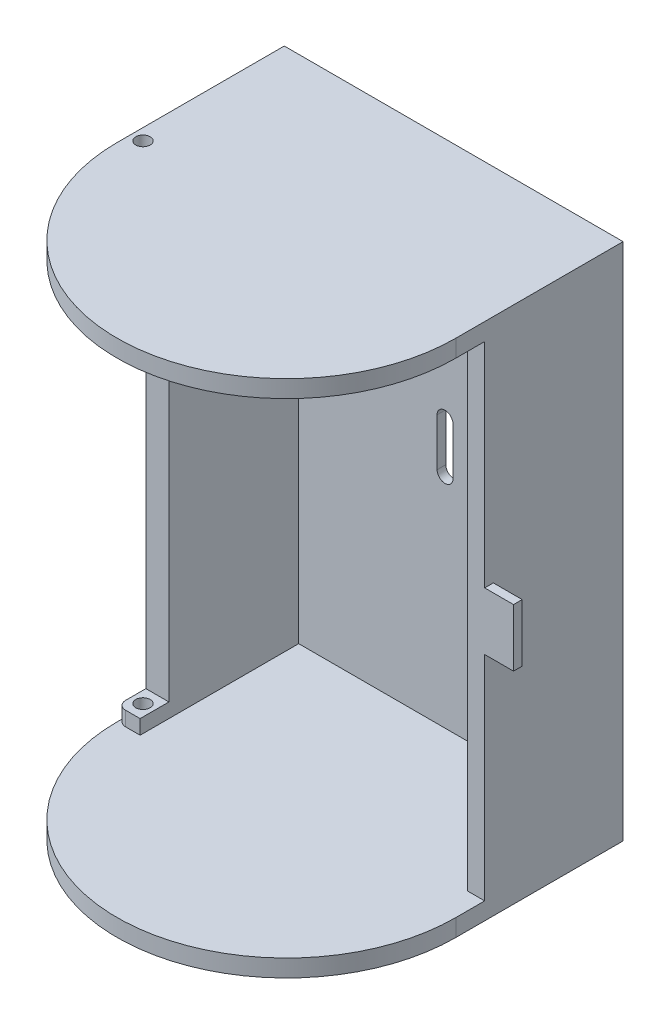
ISO-10303-21;
HEADER;
FILE_DESCRIPTION(('STEP AP214'),'2;1');
FILE_NAME('part.step','',(''),(''),'','','');
FILE_SCHEMA(('AUTOMOTIVE_DESIGN { 1 0 10303 214 1 1 1 1 }'));
ENDSEC;
DATA;
#1=APPLICATION_CONTEXT('core data for automotive mechanical design processes');
#2=APPLICATION_PROTOCOL_DEFINITION('international standard','automotive_design',2000,#1);
#3=PRODUCT_CONTEXT('',#1,'mechanical');
#4=PRODUCT('Part','Part','',(#3));
#5=PRODUCT_RELATED_PRODUCT_CATEGORY('part','',(#4));
#6=PRODUCT_DEFINITION_FORMATION('','',#4);
#7=PRODUCT_DEFINITION_CONTEXT('part definition',#1,'design');
#8=PRODUCT_DEFINITION('design','',#6,#7);
#9=PRODUCT_DEFINITION_SHAPE('','',#8);
#10=(LENGTH_UNIT() NAMED_UNIT(*) SI_UNIT(.MILLI.,.METRE.));
#11=(NAMED_UNIT(*) PLANE_ANGLE_UNIT() SI_UNIT($,.RADIAN.));
#12=(NAMED_UNIT(*) SI_UNIT($,.STERADIAN.) SOLID_ANGLE_UNIT());
#13=UNCERTAINTY_MEASURE_WITH_UNIT(LENGTH_MEASURE(1.E-05),#10,'distance_accuracy_value','');
#14=(GEOMETRIC_REPRESENTATION_CONTEXT(3) GLOBAL_UNCERTAINTY_ASSIGNED_CONTEXT((#13)) GLOBAL_UNIT_ASSIGNED_CONTEXT((#10,
#11,#12)) REPRESENTATION_CONTEXT('',''));
#15=CARTESIAN_POINT('',(0.,0.,0.));
#16=DIRECTION('',(0.,0.,1.));
#17=DIRECTION('',(1.,0.,0.));
#18=AXIS2_PLACEMENT_3D('',#15,#16,#17);
#19=CARTESIAN_POINT('',(58.75,90.,3.));
#20=DIRECTION('',(-1.,0.,0.));
#21=DIRECTION('',(0.,-1.,0.));
#22=AXIS2_PLACEMENT_3D('',#19,#20,#21);
#23=PLANE('',#22);
#24=DIRECTION('',(0.,0.,1.));
#25=VECTOR('',#24,1.);
#26=CARTESIAN_POINT('',(58.75,10.,48.));
#27=LINE('',#26,#25);
#28=CARTESIAN_POINT('',(58.75,10.,45.));
#29=VERTEX_POINT('',#28);
#30=CARTESIAN_POINT('',(58.75,10.,48.));
#31=VERTEX_POINT('',#30);
#32=EDGE_CURVE('E560',#29,#31,#27,.T.);
#33=ORIENTED_EDGE('',*,*,#32,.F.);
#34=DIRECTION('',(0.,1.,0.));
#35=VECTOR('',#34,1.);
#36=CARTESIAN_POINT('',(58.75,10.,45.));
#37=LINE('',#36,#35);
#38=CARTESIAN_POINT('',(58.75,-9.99999999999998,45.));
#39=VERTEX_POINT('',#38);
#40=EDGE_CURVE('E231',#39,#29,#37,.T.);
#41=ORIENTED_EDGE('',*,*,#40,.F.);
#42=DIRECTION('',(0.,0.,-1.));
#43=VECTOR('',#42,1.);
#44=CARTESIAN_POINT('',(58.75,-9.99999999999998,48.));
#45=LINE('',#44,#43);
#46=CARTESIAN_POINT('',(58.75,-9.99999999999998,48.));
#47=VERTEX_POINT('',#46);
#48=EDGE_CURVE('E227',#47,#39,#45,.T.);
#49=ORIENTED_EDGE('',*,*,#48,.F.);
#50=DIRECTION('',(0.,1.,0.));
#51=VECTOR('',#50,1.);
#52=CARTESIAN_POINT('',(58.75,83.9999999999999,48.));
#53=LINE('',#52,#51);
#54=CARTESIAN_POINT('',(58.75,-84.,48.));
#55=VERTEX_POINT('',#54);
#56=EDGE_CURVE('E269',#55,#47,#53,.T.);
#57=ORIENTED_EDGE('',*,*,#56,.F.);
#58=DIRECTION('',(0.,0.,1.));
#59=VECTOR('',#58,1.);
#60=CARTESIAN_POINT('',(58.75,-84.,58.));
#61=LINE('',#60,#59);
#62=CARTESIAN_POINT('',(58.75,-84.,58.));
#63=VERTEX_POINT('',#62);
#64=EDGE_CURVE('E364',#55,#63,#61,.T.);
#65=ORIENTED_EDGE('',*,*,#64,.T.);
#66=DIRECTION('',(0.,-1.,0.));
#67=VECTOR('',#66,1.);
#68=CARTESIAN_POINT('',(58.75,-84.,58.));
#69=LINE('',#68,#67);
#70=CARTESIAN_POINT('',(58.75,-90.,58.));
#71=VERTEX_POINT('',#70);
#72=EDGE_CURVE('E369',#63,#71,#69,.T.);
#73=ORIENTED_EDGE('',*,*,#72,.T.);
#74=DIRECTION('',(0.,0.,-1.));
#75=VECTOR('',#74,1.);
#76=CARTESIAN_POINT('',(58.75,-90.,3.));
#77=LINE('',#76,#75);
#78=CARTESIAN_POINT('',(58.75,-90.,0.));
#79=VERTEX_POINT('',#78);
#80=EDGE_CURVE('E386',#71,#79,#77,.T.);
#81=ORIENTED_EDGE('',*,*,#80,.T.);
#82=DIRECTION('',(0.,1.,0.));
#83=VECTOR('',#82,1.);
#84=CARTESIAN_POINT('',(58.75,90.,0.));
#85=LINE('',#84,#83);
#86=CARTESIAN_POINT('',(58.75,90.,0.));
#87=VERTEX_POINT('',#86);
#88=EDGE_CURVE('E375',#79,#87,#85,.T.);
#89=ORIENTED_EDGE('',*,*,#88,.T.);
#90=DIRECTION('',(0.,0.,-1.));
#91=VECTOR('',#90,1.);
#92=CARTESIAN_POINT('',(58.75,90.,3.));
#93=LINE('',#92,#91);
#94=CARTESIAN_POINT('',(58.75,90.,58.));
#95=VERTEX_POINT('',#94);
#96=EDGE_CURVE('E395',#95,#87,#93,.T.);
#97=ORIENTED_EDGE('',*,*,#96,.F.);
#98=DIRECTION('',(0.,1.,0.));
#99=VECTOR('',#98,1.);
#100=CARTESIAN_POINT('',(58.75,84.,58.));
#101=LINE('',#100,#99);
#102=CARTESIAN_POINT('',(58.75,84.,58.));
#103=VERTEX_POINT('',#102);
#104=EDGE_CURVE('E355',#103,#95,#101,.T.);
#105=ORIENTED_EDGE('',*,*,#104,.F.);
#106=DIRECTION('',(0.,0.,-1.));
#107=VECTOR('',#106,1.);
#108=CARTESIAN_POINT('',(58.75,84.,58.));
#109=LINE('',#108,#107);
#110=CARTESIAN_POINT('',(58.75,84.,48.));
#111=VERTEX_POINT('',#110);
#112=EDGE_CURVE('E349',#103,#111,#109,.T.);
#113=ORIENTED_EDGE('',*,*,#112,.T.);
#114=EDGE_CURVE('E273',#31,#111,#53,.T.);
#115=ORIENTED_EDGE('',*,*,#114,.F.);
#116=EDGE_LOOP('',(#33,#41,#49,#57,#65,#73,#81,#89,#97,#105,#113,#115));
#117=FACE_BOUND('',#116,.T.);
#118=ADVANCED_FACE('F39',(#117),#23,.F.);
#119=CARTESIAN_POINT('',(0.,0.,3.));
#120=DIRECTION('',(0.,0.,1.));
#121=DIRECTION('',(1.,0.,0.));
#122=AXIS2_PLACEMENT_3D('',#119,#120,#121);
#123=PLANE('',#122);
#124=DIRECTION('',(0.,1.,0.));
#125=VECTOR('',#124,1.);
#126=CARTESIAN_POINT('',(2.75,0.,3.));
#127=LINE('',#126,#125);
#128=CARTESIAN_POINT('',(2.75,-7.75458712090574,3.));
#129=VERTEX_POINT('',#128);
#130=CARTESIAN_POINT('',(2.75,8.74541287909426,3.));
#131=VERTEX_POINT('',#130);
#132=EDGE_CURVE('E263',#129,#131,#127,.T.);
#133=ORIENTED_EDGE('',*,*,#132,.F.);
#134=CARTESIAN_POINT('',(0.,-7.75458712090574,3.));
#135=DIRECTION('',(0.,0.,1.));
#136=DIRECTION('',(1.,0.,0.));
#137=AXIS2_PLACEMENT_3D('',#134,#135,#136);
#138=CIRCLE('',#137,2.75);
#139=CARTESIAN_POINT('',(-2.75,-7.75458712090574,3.));
#140=VERTEX_POINT('',#139);
#141=EDGE_CURVE('E251',#140,#129,#138,.T.);
#142=ORIENTED_EDGE('',*,*,#141,.F.);
#143=DIRECTION('',(0.,1.,0.));
#144=VECTOR('',#143,1.);
#145=CARTESIAN_POINT('',(-2.75,0.,3.));
#146=LINE('',#145,#144);
#147=CARTESIAN_POINT('',(-2.75,8.74541287909426,3.));
#148=VERTEX_POINT('',#147);
#149=EDGE_CURVE('E258',#140,#148,#146,.T.);
#150=ORIENTED_EDGE('',*,*,#149,.T.);
#151=CARTESIAN_POINT('',(0.,8.74541287909426,3.));
#152=DIRECTION('',(0.,0.,1.));
#153=DIRECTION('',(1.,0.,0.));
#154=AXIS2_PLACEMENT_3D('',#151,#152,#153);
#155=CIRCLE('',#154,2.75);
#156=EDGE_CURVE('E261',#131,#148,#155,.T.);
#157=ORIENTED_EDGE('',*,*,#156,.F.);
#158=EDGE_LOOP('',(#133,#142,#150,#157));
#159=FACE_BOUND('',#158,.T.);
#160=DIRECTION('',(1.,0.,0.));
#161=VECTOR('',#160,1.);
#162=CARTESIAN_POINT('',(58.75,-84.,3.00000000000001));
#163=LINE('',#162,#161);
#164=CARTESIAN_POINT('',(-50.75,-84.,3.));
#165=VERTEX_POINT('',#164);
#166=CARTESIAN_POINT('',(52.75,-84.,3.));
#167=VERTEX_POINT('',#166);
#168=EDGE_CURVE('E361',#165,#167,#163,.T.);
#169=ORIENTED_EDGE('',*,*,#168,.T.);
#170=DIRECTION('',(0.,-1.,0.));
#171=VECTOR('',#170,1.);
#172=CARTESIAN_POINT('',(52.75,-84.,3.));
#173=LINE('',#172,#171);
#174=CARTESIAN_POINT('',(52.75,84.,3.));
#175=VERTEX_POINT('',#174);
#176=EDGE_CURVE('E266',#175,#167,#173,.T.);
#177=ORIENTED_EDGE('',*,*,#176,.F.);
#178=DIRECTION('',(-1.,0.,0.));
#179=VECTOR('',#178,1.);
#180=CARTESIAN_POINT('',(58.75,84.,3.));
#181=LINE('',#180,#179);
#182=CARTESIAN_POINT('',(-50.75,84.,3.));
#183=VERTEX_POINT('',#182);
#184=EDGE_CURVE('E344',#175,#183,#181,.T.);
#185=ORIENTED_EDGE('',*,*,#184,.T.);
#186=DIRECTION('',(0.,-1.,0.));
#187=VECTOR('',#186,1.);
#188=CARTESIAN_POINT('',(-50.75,-84.,3.));
#189=LINE('',#188,#187);
#190=EDGE_CURVE('E296',#183,#165,#189,.T.);
#191=ORIENTED_EDGE('',*,*,#190,.T.);
#192=EDGE_LOOP('',(#169,#177,#185,#191));
#193=FACE_BOUND('',#192,.T.);
#194=ADVANCED_FACE('F444',(#159,#193),#123,.T.);
#195=CARTESIAN_POINT('',(0.,-84.,58.));
#196=DIRECTION('',(0.,1.,0.));
#197=DIRECTION('',(0.,0.,1.));
#198=AXIS2_PLACEMENT_3D('',#195,#196,#197);
#199=PLANE('',#198);
#200=DIRECTION('',(1.,0.,0.));
#201=VECTOR('',#200,1.);
#202=CARTESIAN_POINT('',(58.75,-84.,48.));
#203=LINE('',#202,#201);
#204=CARTESIAN_POINT('',(52.75,-84.,48.));
#205=VERTEX_POINT('',#204);
#206=EDGE_CURVE('E274',#205,#55,#203,.T.);
#207=ORIENTED_EDGE('',*,*,#206,.F.);
#208=DIRECTION('',(0.,0.,-1.));
#209=VECTOR('',#208,1.);
#210=CARTESIAN_POINT('',(52.75,-84.,216.107108713463));
#211=LINE('',#210,#209);
#212=EDGE_CURVE('E268',#205,#167,#211,.T.);
#213=ORIENTED_EDGE('',*,*,#212,.T.);
#214=ORIENTED_EDGE('',*,*,#168,.F.);
#215=DIRECTION('',(0.,0.,1.));
#216=VECTOR('',#215,1.);
#217=CARTESIAN_POINT('',(-50.75,-84.,58.));
#218=LINE('',#217,#216);
#219=CARTESIAN_POINT('',(-50.75,-84.,58.));
#220=VERTEX_POINT('',#219);
#221=EDGE_CURVE('E299',#165,#220,#218,.T.);
#222=ORIENTED_EDGE('',*,*,#221,.T.);
#223=DIRECTION('',(-1.,0.,0.));
#224=VECTOR('',#223,1.);
#225=CARTESIAN_POINT('',(-50.75,-84.,58.));
#226=LINE('',#225,#224);
#227=CARTESIAN_POINT('',(-55.75,-84.,58.));
#228=VERTEX_POINT('',#227);
#229=EDGE_CURVE('E320',#220,#228,#226,.T.);
#230=ORIENTED_EDGE('',*,*,#229,.T.);
#231=CARTESIAN_POINT('',(-55.75,-84.,55.));
#232=DIRECTION('',(0.,1.,0.));
#233=DIRECTION('',(0.,0.,1.));
#234=AXIS2_PLACEMENT_3D('',#231,#232,#233);
#235=CIRCLE('',#234,3.);
#236=CARTESIAN_POINT('',(-58.75,-84.,55.));
#237=VERTEX_POINT('',#236);
#238=EDGE_CURVE('E47',#228,#237,#235,.F.);
#239=ORIENTED_EDGE('',*,*,#238,.T.);
#240=DIRECTION('',(0.,0.,-1.));
#241=VECTOR('',#240,1.);
#242=CARTESIAN_POINT('',(-58.75,-84.,58.));
#243=LINE('',#242,#241);
#244=CARTESIAN_POINT('',(-58.75,-84.,58.));
#245=VERTEX_POINT('',#244);
#246=EDGE_CURVE('E405',#245,#237,#243,.T.);
#247=ORIENTED_EDGE('',*,*,#246,.F.);
#248=CARTESIAN_POINT('',(0.,-84.,58.));
#249=DIRECTION('',(0.,-1.,0.));
#250=DIRECTION('',(0.,0.,1.));
#251=AXIS2_PLACEMENT_3D('',#248,#249,#250);
#252=CIRCLE('',#251,58.75);
#253=EDGE_CURVE('E366',#63,#245,#252,.T.);
#254=ORIENTED_EDGE('',*,*,#253,.F.);
#255=ORIENTED_EDGE('',*,*,#64,.F.);
#256=EDGE_LOOP('',(#207,#213,#214,#222,#230,#239,#247,#254,#255));
#257=FACE_BOUND('',#256,.T.);
#258=ADVANCED_FACE('F421',(#257),#199,.T.);
#259=CARTESIAN_POINT('',(0.,84.,58.));
#260=DIRECTION('',(0.,1.,0.));
#261=DIRECTION('',(0.,0.,1.));
#262=AXIS2_PLACEMENT_3D('',#259,#260,#261);
#263=PLANE('',#262);
#264=DIRECTION('',(0.,0.,-1.));
#265=VECTOR('',#264,1.);
#266=CARTESIAN_POINT('',(52.75,84.,216.107108713463));
#267=LINE('',#266,#265);
#268=CARTESIAN_POINT('',(52.75,84.,48.));
#269=VERTEX_POINT('',#268);
#270=EDGE_CURVE('E265',#269,#175,#267,.T.);
#271=ORIENTED_EDGE('',*,*,#270,.F.);
#272=DIRECTION('',(-1.,0.,0.));
#273=VECTOR('',#272,1.);
#274=CARTESIAN_POINT('',(52.75,84.,48.));
#275=LINE('',#274,#273);
#276=EDGE_CURVE('E280',#111,#269,#275,.T.);
#277=ORIENTED_EDGE('',*,*,#276,.F.);
#278=ORIENTED_EDGE('',*,*,#112,.F.);
#279=CARTESIAN_POINT('',(0.,84.,58.));
#280=DIRECTION('',(0.,1.,0.));
#281=DIRECTION('',(0.,0.,1.));
#282=AXIS2_PLACEMENT_3D('',#279,#280,#281);
#283=CIRCLE('',#282,58.75);
#284=CARTESIAN_POINT('',(-58.75,84.,58.));
#285=VERTEX_POINT('',#284);
#286=EDGE_CURVE('E346',#285,#103,#283,.T.);
#287=ORIENTED_EDGE('',*,*,#286,.F.);
#288=DIRECTION('',(0.,0.,1.));
#289=VECTOR('',#288,1.);
#290=CARTESIAN_POINT('',(-58.75,84.,3.));
#291=LINE('',#290,#289);
#292=CARTESIAN_POINT('',(-58.75,84.,55.));
#293=VERTEX_POINT('',#292);
#294=EDGE_CURVE('E398',#293,#285,#291,.T.);
#295=ORIENTED_EDGE('',*,*,#294,.F.);
#296=CARTESIAN_POINT('',(-55.75,84.,55.));
#297=DIRECTION('',(0.,1.,0.));
#298=DIRECTION('',(0.,0.,1.));
#299=AXIS2_PLACEMENT_3D('',#296,#297,#298);
#300=CIRCLE('',#299,3.);
#301=CARTESIAN_POINT('',(-55.75,84.,58.));
#302=VERTEX_POINT('',#301);
#303=EDGE_CURVE('E11',#293,#302,#300,.T.);
#304=ORIENTED_EDGE('',*,*,#303,.T.);
#305=DIRECTION('',(-1.,0.,0.));
#306=VECTOR('',#305,1.);
#307=CARTESIAN_POINT('',(-50.75,84.,58.));
#308=LINE('',#307,#306);
#309=CARTESIAN_POINT('',(-50.75,84.,58.));
#310=VERTEX_POINT('',#309);
#311=EDGE_CURVE('E327',#310,#302,#308,.T.);
#312=ORIENTED_EDGE('',*,*,#311,.F.);
#313=DIRECTION('',(0.,0.,-1.));
#314=VECTOR('',#313,1.);
#315=CARTESIAN_POINT('',(-50.75,84.,3.));
#316=LINE('',#315,#314);
#317=EDGE_CURVE('E317',#310,#183,#316,.T.);
#318=ORIENTED_EDGE('',*,*,#317,.T.);
#319=ORIENTED_EDGE('',*,*,#184,.F.);
#320=EDGE_LOOP('',(#271,#277,#278,#287,#295,#304,#312,#318,#319));
#321=FACE_BOUND('',#320,.T.);
#322=ADVANCED_FACE('F451',(#321),#263,.F.);
#323=CARTESIAN_POINT('',(-58.75,90.,3.));
#324=DIRECTION('',(0.,-1.,0.));
#325=DIRECTION('',(0.,0.,-1.));
#326=AXIS2_PLACEMENT_3D('',#323,#324,#325);
#327=PLANE('',#326);
#328=CARTESIAN_POINT('',(-54.75,90.,53.));
#329=DIRECTION('',(0.,-1.,0.));
#330=DIRECTION('',(0.,0.,-1.));
#331=AXIS2_PLACEMENT_3D('',#328,#329,#330);
#332=CIRCLE('',#331,2.5);
#333=CARTESIAN_POINT('',(-54.75,90.,50.5));
#334=VERTEX_POINT('',#333);
#335=EDGE_CURVE('E292',#334,#334,#332,.F.);
#336=ORIENTED_EDGE('',*,*,#335,.F.);
#337=EDGE_LOOP('',(#336));
#338=FACE_BOUND('',#337,.T.);
#339=DIRECTION('',(-1.,0.,0.));
#340=VECTOR('',#339,1.);
#341=CARTESIAN_POINT('',(-58.75,90.,0.));
#342=LINE('',#341,#340);
#343=CARTESIAN_POINT('',(-58.75,90.,0.));
#344=VERTEX_POINT('',#343);
#345=EDGE_CURVE('E380',#87,#344,#342,.T.);
#346=ORIENTED_EDGE('',*,*,#345,.T.);
#347=DIRECTION('',(0.,0.,-1.));
#348=VECTOR('',#347,1.);
#349=CARTESIAN_POINT('',(-58.75,90.,3.));
#350=LINE('',#349,#348);
#351=CARTESIAN_POINT('',(-58.75,90.,58.));
#352=VERTEX_POINT('',#351);
#353=EDGE_CURVE('E392',#352,#344,#350,.T.);
#354=ORIENTED_EDGE('',*,*,#353,.F.);
#355=CARTESIAN_POINT('',(0.,90.,58.));
#356=DIRECTION('',(0.,1.,0.));
#357=DIRECTION('',(0.,0.,1.));
#358=AXIS2_PLACEMENT_3D('',#355,#356,#357);
#359=CIRCLE('',#358,58.75);
#360=EDGE_CURVE('E330',#352,#95,#359,.T.);
#361=ORIENTED_EDGE('',*,*,#360,.T.);
#362=ORIENTED_EDGE('',*,*,#96,.T.);
#363=EDGE_LOOP('',(#346,#354,#361,#362));
#364=FACE_BOUND('',#363,.T.);
#365=ADVANCED_FACE('F485',(#338,#364),#327,.F.);
#366=CARTESIAN_POINT('',(-58.75,90.,3.));
#367=DIRECTION('',(1.,0.,0.));
#368=DIRECTION('',(0.,1.,0.));
#369=AXIS2_PLACEMENT_3D('',#366,#367,#368);
#370=PLANE('',#369);
#371=ORIENTED_EDGE('',*,*,#246,.T.);
#372=DIRECTION('',(0.,1.,0.));
#373=VECTOR('',#372,1.);
#374=CARTESIAN_POINT('',(-58.75,-79.,55.));
#375=LINE('',#374,#373);
#376=CARTESIAN_POINT('',(-58.75,-79.,55.));
#377=VERTEX_POINT('',#376);
#378=EDGE_CURVE('E408',#237,#377,#375,.T.);
#379=ORIENTED_EDGE('',*,*,#378,.T.);
#380=DIRECTION('',(0.,0.,-1.));
#381=VECTOR('',#380,1.);
#382=CARTESIAN_POINT('',(-58.75,-79.,48.));
#383=LINE('',#382,#381);
#384=CARTESIAN_POINT('',(-58.75,-79.,48.));
#385=VERTEX_POINT('',#384);
#386=EDGE_CURVE('E295',#377,#385,#383,.T.);
#387=ORIENTED_EDGE('',*,*,#386,.T.);
#388=DIRECTION('',(0.,1.,0.));
#389=VECTOR('',#388,1.);
#390=CARTESIAN_POINT('',(-58.75,79.,48.));
#391=LINE('',#390,#389);
#392=CARTESIAN_POINT('',(-58.75,79.,48.));
#393=VERTEX_POINT('',#392);
#394=EDGE_CURVE('E322',#385,#393,#391,.T.);
#395=ORIENTED_EDGE('',*,*,#394,.T.);
#396=DIRECTION('',(0.,0.,1.));
#397=VECTOR('',#396,1.);
#398=CARTESIAN_POINT('',(-58.75,79.,58.));
#399=LINE('',#398,#397);
#400=CARTESIAN_POINT('',(-58.75,79.,55.));
#401=VERTEX_POINT('',#400);
#402=EDGE_CURVE('E300',#393,#401,#399,.T.);
#403=ORIENTED_EDGE('',*,*,#402,.T.);
#404=DIRECTION('',(0.,1.,0.));
#405=VECTOR('',#404,1.);
#406=CARTESIAN_POINT('',(-58.75,83.9999999999999,55.));
#407=LINE('',#406,#405);
#408=EDGE_CURVE('E402',#401,#293,#407,.T.);
#409=ORIENTED_EDGE('',*,*,#408,.T.);
#410=ORIENTED_EDGE('',*,*,#294,.T.);
#411=DIRECTION('',(0.,1.,0.));
#412=VECTOR('',#411,1.);
#413=CARTESIAN_POINT('',(-58.75,84.,58.));
#414=LINE('',#413,#412);
#415=EDGE_CURVE('E352',#285,#352,#414,.T.);
#416=ORIENTED_EDGE('',*,*,#415,.T.);
#417=ORIENTED_EDGE('',*,*,#353,.T.);
#418=DIRECTION('',(0.,-1.,0.));
#419=VECTOR('',#418,1.);
#420=CARTESIAN_POINT('',(-58.75,90.,0.));
#421=LINE('',#420,#419);
#422=CARTESIAN_POINT('',(-58.75,-90.,0.));
#423=VERTEX_POINT('',#422);
#424=EDGE_CURVE('E382',#344,#423,#421,.T.);
#425=ORIENTED_EDGE('',*,*,#424,.T.);
#426=DIRECTION('',(0.,0.,-1.));
#427=VECTOR('',#426,1.);
#428=CARTESIAN_POINT('',(-58.75,-90.,3.));
#429=LINE('',#428,#427);
#430=CARTESIAN_POINT('',(-58.75,-90.,58.));
#431=VERTEX_POINT('',#430);
#432=EDGE_CURVE('E389',#431,#423,#429,.T.);
#433=ORIENTED_EDGE('',*,*,#432,.F.);
#434=DIRECTION('',(0.,-1.,0.));
#435=VECTOR('',#434,1.);
#436=CARTESIAN_POINT('',(-58.75,-84.,58.));
#437=LINE('',#436,#435);
#438=EDGE_CURVE('E372',#245,#431,#437,.T.);
#439=ORIENTED_EDGE('',*,*,#438,.F.);
#440=EDGE_LOOP('',(#371,#379,#387,#395,#403,#409,#410,#416,#417,#425,#433,#439));
#441=FACE_BOUND('',#440,.T.);
#442=ADVANCED_FACE('F428',(#441),#370,.F.);
#443=CARTESIAN_POINT('',(-58.75,-90.,3.));
#444=DIRECTION('',(0.,1.,0.));
#445=DIRECTION('',(0.,0.,1.));
#446=AXIS2_PLACEMENT_3D('',#443,#444,#445);
#447=PLANE('',#446);
#448=CARTESIAN_POINT('',(-54.75,-90.,53.));
#449=DIRECTION('',(0.,1.,0.));
#450=DIRECTION('',(0.,0.,1.));
#451=AXIS2_PLACEMENT_3D('',#448,#449,#450);
#452=CIRCLE('',#451,2.5);
#453=CARTESIAN_POINT('',(-54.75,-90.,55.5));
#454=VERTEX_POINT('',#453);
#455=EDGE_CURVE('E289',#454,#454,#452,.F.);
#456=ORIENTED_EDGE('',*,*,#455,.F.);
#457=EDGE_LOOP('',(#456));
#458=FACE_BOUND('',#457,.T.);
#459=DIRECTION('',(1.,0.,0.));
#460=VECTOR('',#459,1.);
#461=CARTESIAN_POINT('',(-58.75,-90.,0.));
#462=LINE('',#461,#460);
#463=EDGE_CURVE('E384',#423,#79,#462,.T.);
#464=ORIENTED_EDGE('',*,*,#463,.T.);
#465=ORIENTED_EDGE('',*,*,#80,.F.);
#466=CARTESIAN_POINT('',(0.,-90.,58.));
#467=DIRECTION('',(0.,-1.,0.));
#468=DIRECTION('',(0.,0.,1.));
#469=AXIS2_PLACEMENT_3D('',#466,#467,#468);
#470=CIRCLE('',#469,58.75);
#471=EDGE_CURVE('E358',#71,#431,#470,.T.);
#472=ORIENTED_EDGE('',*,*,#471,.T.);
#473=ORIENTED_EDGE('',*,*,#432,.T.);
#474=EDGE_LOOP('',(#464,#465,#472,#473));
#475=FACE_BOUND('',#474,.T.);
#476=ADVANCED_FACE('F531',(#458,#475),#447,.F.);
#477=CARTESIAN_POINT('',(0.,0.,0.));
#478=DIRECTION('',(0.,0.,1.));
#479=DIRECTION('',(1.,0.,0.));
#480=AXIS2_PLACEMENT_3D('',#477,#478,#479);
#481=PLANE('',#480);
#482=CARTESIAN_POINT('',(0.,-7.75458712090574,0.));
#483=DIRECTION('',(0.,0.,-1.));
#484=DIRECTION('',(-1.,0.,0.));
#485=AXIS2_PLACEMENT_3D('',#482,#483,#484);
#486=CIRCLE('',#485,2.75);
#487=CARTESIAN_POINT('',(2.75,-7.75458712090574,0.));
#488=VERTEX_POINT('',#487);
#489=CARTESIAN_POINT('',(-2.75,-7.75458712090574,0.));
#490=VERTEX_POINT('',#489);
#491=EDGE_CURVE('E235',#488,#490,#486,.T.);
#492=ORIENTED_EDGE('',*,*,#491,.F.);
#493=DIRECTION('',(0.,-1.,0.));
#494=VECTOR('',#493,1.);
#495=CARTESIAN_POINT('',(2.75,8.74541287909426,0.));
#496=LINE('',#495,#494);
#497=CARTESIAN_POINT('',(2.75,8.74541287909426,0.));
#498=VERTEX_POINT('',#497);
#499=EDGE_CURVE('E233',#498,#488,#496,.T.);
#500=ORIENTED_EDGE('',*,*,#499,.F.);
#501=CARTESIAN_POINT('',(0.,8.74541287909426,0.));
#502=DIRECTION('',(0.,0.,-1.));
#503=DIRECTION('',(-1.,0.,0.));
#504=AXIS2_PLACEMENT_3D('',#501,#502,#503);
#505=CIRCLE('',#504,2.75);
#506=CARTESIAN_POINT('',(-2.75,8.74541287909426,0.));
#507=VERTEX_POINT('',#506);
#508=EDGE_CURVE('E245',#507,#498,#505,.T.);
#509=ORIENTED_EDGE('',*,*,#508,.F.);
#510=DIRECTION('',(0.,-1.,0.));
#511=VECTOR('',#510,1.);
#512=CARTESIAN_POINT('',(-2.75,8.74541287909426,0.));
#513=LINE('',#512,#511);
#514=EDGE_CURVE('E242',#507,#490,#513,.T.);
#515=ORIENTED_EDGE('',*,*,#514,.T.);
#516=EDGE_LOOP('',(#492,#500,#509,#515));
#517=FACE_BOUND('',#516,.T.);
#518=ORIENTED_EDGE('',*,*,#88,.F.);
#519=ORIENTED_EDGE('',*,*,#463,.F.);
#520=ORIENTED_EDGE('',*,*,#424,.F.);
#521=ORIENTED_EDGE('',*,*,#345,.F.);
#522=EDGE_LOOP('',(#518,#519,#520,#521));
#523=FACE_BOUND('',#522,.T.);
#524=ADVANCED_FACE('F520',(#517,#523),#481,.F.);
#525=CARTESIAN_POINT('',(0.,-84.,58.));
#526=DIRECTION('',(0.,-1.,0.));
#527=DIRECTION('',(0.,0.,-1.));
#528=AXIS2_PLACEMENT_3D('',#525,#526,#527);
#529=CYLINDRICAL_SURFACE('',#528,58.75);
#530=ORIENTED_EDGE('',*,*,#471,.F.);
#531=ORIENTED_EDGE('',*,*,#72,.F.);
#532=ORIENTED_EDGE('',*,*,#253,.T.);
#533=ORIENTED_EDGE('',*,*,#438,.T.);
#534=EDGE_LOOP('',(#530,#531,#532,#533));
#535=FACE_BOUND('',#534,.T.);
#536=ADVANCED_FACE('F514',(#535),#529,.T.);
#537=CARTESIAN_POINT('',(0.,84.,58.));
#538=DIRECTION('',(0.,1.,0.));
#539=DIRECTION('',(0.,0.,1.));
#540=AXIS2_PLACEMENT_3D('',#537,#538,#539);
#541=CYLINDRICAL_SURFACE('',#540,58.75);
#542=ORIENTED_EDGE('',*,*,#360,.F.);
#543=ORIENTED_EDGE('',*,*,#415,.F.);
#544=ORIENTED_EDGE('',*,*,#286,.T.);
#545=ORIENTED_EDGE('',*,*,#104,.T.);
#546=EDGE_LOOP('',(#542,#543,#544,#545));
#547=FACE_BOUND('',#546,.T.);
#548=ADVANCED_FACE('F510',(#547),#541,.T.);
#549=CARTESIAN_POINT('',(-50.75,84.,58.));
#550=DIRECTION('',(0.,0.,1.));
#551=DIRECTION('',(0.,-1.,0.));
#552=AXIS2_PLACEMENT_3D('',#549,#550,#551);
#553=PLANE('',#552);
#554=ORIENTED_EDGE('',*,*,#311,.T.);
#555=DIRECTION('',(0.,1.,0.));
#556=VECTOR('',#555,1.);
#557=CARTESIAN_POINT('',(-55.75,79.,58.));
#558=LINE('',#557,#556);
#559=CARTESIAN_POINT('',(-55.75,79.,58.));
#560=VERTEX_POINT('',#559);
#561=EDGE_CURVE('E415',#302,#560,#558,.F.);
#562=ORIENTED_EDGE('',*,*,#561,.T.);
#563=DIRECTION('',(-1.,0.,0.));
#564=VECTOR('',#563,1.);
#565=CARTESIAN_POINT('',(-50.75,79.,58.));
#566=LINE('',#565,#564);
#567=CARTESIAN_POINT('',(-50.75,79.,58.));
#568=VERTEX_POINT('',#567);
#569=EDGE_CURVE('E331',#568,#560,#566,.T.);
#570=ORIENTED_EDGE('',*,*,#569,.F.);
#571=DIRECTION('',(0.,1.,0.));
#572=VECTOR('',#571,1.);
#573=CARTESIAN_POINT('',(-50.75,84.,58.));
#574=LINE('',#573,#572);
#575=EDGE_CURVE('E315',#568,#310,#574,.T.);
#576=ORIENTED_EDGE('',*,*,#575,.T.);
#577=EDGE_LOOP('',(#554,#562,#570,#576));
#578=FACE_BOUND('',#577,.T.);
#579=ADVANCED_FACE('F455',(#578),#553,.T.);
#580=CARTESIAN_POINT('',(-50.75,79.,58.));
#581=DIRECTION('',(0.,-1.,0.));
#582=DIRECTION('',(0.,0.,-1.));
#583=AXIS2_PLACEMENT_3D('',#580,#581,#582);
#584=PLANE('',#583);
#585=CARTESIAN_POINT('',(-54.75,79.,53.));
#586=DIRECTION('',(0.,-1.,0.));
#587=DIRECTION('',(0.,0.,-1.));
#588=AXIS2_PLACEMENT_3D('',#585,#586,#587);
#589=CIRCLE('',#588,2.5);
#590=CARTESIAN_POINT('',(-54.75,79.,50.5));
#591=VERTEX_POINT('',#590);
#592=EDGE_CURVE('E286',#591,#591,#589,.F.);
#593=ORIENTED_EDGE('',*,*,#592,.T.);
#594=EDGE_LOOP('',(#593));
#595=FACE_BOUND('',#594,.T.);
#596=ORIENTED_EDGE('',*,*,#569,.T.);
#597=CARTESIAN_POINT('',(-55.75,79.,55.));
#598=DIRECTION('',(0.,-1.,0.));
#599=DIRECTION('',(0.,0.,-1.));
#600=AXIS2_PLACEMENT_3D('',#597,#598,#599);
#601=CIRCLE('',#600,3.);
#602=EDGE_CURVE('E417',#560,#401,#601,.T.);
#603=ORIENTED_EDGE('',*,*,#602,.T.);
#604=ORIENTED_EDGE('',*,*,#402,.F.);
#605=DIRECTION('',(-1.,0.,0.));
#606=VECTOR('',#605,1.);
#607=CARTESIAN_POINT('',(-50.75,79.,48.));
#608=LINE('',#607,#606);
#609=CARTESIAN_POINT('',(-50.75,79.,48.));
#610=VERTEX_POINT('',#609);
#611=EDGE_CURVE('E334',#610,#393,#608,.T.);
#612=ORIENTED_EDGE('',*,*,#611,.F.);
#613=DIRECTION('',(0.,0.,1.));
#614=VECTOR('',#613,1.);
#615=CARTESIAN_POINT('',(-50.75,79.,58.));
#616=LINE('',#615,#614);
#617=EDGE_CURVE('E312',#610,#568,#616,.T.);
#618=ORIENTED_EDGE('',*,*,#617,.T.);
#619=EDGE_LOOP('',(#596,#603,#604,#612,#618));
#620=FACE_BOUND('',#619,.T.);
#621=ADVANCED_FACE('F461',(#595,#620),#584,.T.);
#622=CARTESIAN_POINT('',(-50.75,79.,48.));
#623=DIRECTION('',(0.,0.,1.));
#624=DIRECTION('',(0.,-1.,0.));
#625=AXIS2_PLACEMENT_3D('',#622,#623,#624);
#626=PLANE('',#625);
#627=ORIENTED_EDGE('',*,*,#394,.F.);
#628=DIRECTION('',(-1.,0.,0.));
#629=VECTOR('',#628,1.);
#630=CARTESIAN_POINT('',(-50.75,-79.,48.));
#631=LINE('',#630,#629);
#632=CARTESIAN_POINT('',(-50.75,-79.,48.));
#633=VERTEX_POINT('',#632);
#634=EDGE_CURVE('E336',#633,#385,#631,.T.);
#635=ORIENTED_EDGE('',*,*,#634,.F.);
#636=DIRECTION('',(0.,1.,0.));
#637=VECTOR('',#636,1.);
#638=CARTESIAN_POINT('',(-50.75,79.,48.));
#639=LINE('',#638,#637);
#640=EDGE_CURVE('E309',#633,#610,#639,.T.);
#641=ORIENTED_EDGE('',*,*,#640,.T.);
#642=ORIENTED_EDGE('',*,*,#611,.T.);
#643=EDGE_LOOP('',(#627,#635,#641,#642));
#644=FACE_BOUND('',#643,.T.);
#645=ADVANCED_FACE('F464',(#644),#626,.T.);
#646=CARTESIAN_POINT('',(-50.75,-79.,48.));
#647=DIRECTION('',(0.,1.,0.));
#648=DIRECTION('',(0.,0.,1.));
#649=AXIS2_PLACEMENT_3D('',#646,#647,#648);
#650=PLANE('',#649);
#651=CARTESIAN_POINT('',(-54.75,-79.,53.));
#652=DIRECTION('',(0.,1.,0.));
#653=DIRECTION('',(0.,0.,1.));
#654=AXIS2_PLACEMENT_3D('',#651,#652,#653);
#655=CIRCLE('',#654,2.5);
#656=CARTESIAN_POINT('',(-54.75,-79.,55.5));
#657=VERTEX_POINT('',#656);
#658=EDGE_CURVE('E272',#657,#657,#655,.F.);
#659=ORIENTED_EDGE('',*,*,#658,.T.);
#660=EDGE_LOOP('',(#659));
#661=FACE_BOUND('',#660,.T.);
#662=ORIENTED_EDGE('',*,*,#386,.F.);
#663=CARTESIAN_POINT('',(-55.75,-79.,55.));
#664=DIRECTION('',(0.,1.,0.));
#665=DIRECTION('',(0.,0.,1.));
#666=AXIS2_PLACEMENT_3D('',#663,#664,#665);
#667=CIRCLE('',#666,3.);
#668=CARTESIAN_POINT('',(-55.75,-79.,58.));
#669=VERTEX_POINT('',#668);
#670=EDGE_CURVE('E411',#377,#669,#667,.T.);
#671=ORIENTED_EDGE('',*,*,#670,.T.);
#672=DIRECTION('',(-1.,0.,0.));
#673=VECTOR('',#672,1.);
#674=CARTESIAN_POINT('',(-50.75,-79.,58.));
#675=LINE('',#674,#673);
#676=CARTESIAN_POINT('',(-50.75,-79.,58.));
#677=VERTEX_POINT('',#676);
#678=EDGE_CURVE('E339',#677,#669,#675,.T.);
#679=ORIENTED_EDGE('',*,*,#678,.F.);
#680=DIRECTION('',(0.,0.,-1.));
#681=VECTOR('',#680,1.);
#682=CARTESIAN_POINT('',(-50.75,-79.,48.));
#683=LINE('',#682,#681);
#684=EDGE_CURVE('E306',#677,#633,#683,.T.);
#685=ORIENTED_EDGE('',*,*,#684,.T.);
#686=ORIENTED_EDGE('',*,*,#634,.T.);
#687=EDGE_LOOP('',(#662,#671,#679,#685,#686));
#688=FACE_BOUND('',#687,.T.);
#689=ADVANCED_FACE('F432',(#661,#688),#650,.T.);
#690=CARTESIAN_POINT('',(-50.75,-79.,58.));
#691=DIRECTION('',(0.,0.,1.));
#692=DIRECTION('',(0.,-1.,0.));
#693=AXIS2_PLACEMENT_3D('',#690,#691,#692);
#694=PLANE('',#693);
#695=ORIENTED_EDGE('',*,*,#678,.T.);
#696=DIRECTION('',(0.,1.,0.));
#697=VECTOR('',#696,1.);
#698=CARTESIAN_POINT('',(-55.75,-84.,58.));
#699=LINE('',#698,#697);
#700=EDGE_CURVE('E413',#669,#228,#699,.F.);
#701=ORIENTED_EDGE('',*,*,#700,.T.);
#702=ORIENTED_EDGE('',*,*,#229,.F.);
#703=DIRECTION('',(0.,1.,0.));
#704=VECTOR('',#703,1.);
#705=CARTESIAN_POINT('',(-50.75,-79.,58.));
#706=LINE('',#705,#704);
#707=EDGE_CURVE('E303',#220,#677,#706,.T.);
#708=ORIENTED_EDGE('',*,*,#707,.T.);
#709=EDGE_LOOP('',(#695,#701,#702,#708));
#710=FACE_BOUND('',#709,.T.);
#711=ADVANCED_FACE('F435',(#710),#694,.T.);
#712=CARTESIAN_POINT('',(-50.75,0.,0.));
#713=DIRECTION('',(1.,0.,0.));
#714=DIRECTION('',(0.,0.,-1.));
#715=AXIS2_PLACEMENT_3D('',#712,#713,#714);
#716=PLANE('',#715);
#717=ORIENTED_EDGE('',*,*,#190,.F.);
#718=ORIENTED_EDGE('',*,*,#317,.F.);
#719=ORIENTED_EDGE('',*,*,#575,.F.);
#720=ORIENTED_EDGE('',*,*,#617,.F.);
#721=ORIENTED_EDGE('',*,*,#640,.F.);
#722=ORIENTED_EDGE('',*,*,#684,.F.);
#723=ORIENTED_EDGE('',*,*,#707,.F.);
#724=ORIENTED_EDGE('',*,*,#221,.F.);
#725=EDGE_LOOP('',(#717,#718,#719,#720,#721,#722,#723,#724));
#726=FACE_BOUND('',#725,.T.);
#727=ADVANCED_FACE('F439',(#726),#716,.T.);
#728=CARTESIAN_POINT('',(-54.75,-109.,53.));
#729=DIRECTION('',(0.,1.,0.));
#730=DIRECTION('',(0.,0.,1.));
#731=AXIS2_PLACEMENT_3D('',#728,#729,#730);
#732=CYLINDRICAL_SURFACE('',#731,2.5);
#733=ORIENTED_EDGE('',*,*,#658,.F.);
#734=EDGE_LOOP('',(#733));
#735=FACE_BOUND('',#734,.T.);
#736=ORIENTED_EDGE('',*,*,#455,.T.);
#737=EDGE_LOOP('',(#736));
#738=FACE_BOUND('',#737,.T.);
#739=ADVANCED_FACE('F494',(#735,#738),#732,.F.);
#740=ORIENTED_EDGE('',*,*,#592,.F.);
#741=EDGE_LOOP('',(#740));
#742=FACE_BOUND('',#741,.T.);
#743=ORIENTED_EDGE('',*,*,#335,.T.);
#744=EDGE_LOOP('',(#743));
#745=FACE_BOUND('',#744,.T.);
#746=ADVANCED_FACE('F488',(#742,#745),#732,.F.);
#747=CARTESIAN_POINT('',(-55.75,89.9999999999998,55.0000000000005));
#748=DIRECTION('',(0.,-1.,0.));
#749=DIRECTION('',(0.,0.,-1.));
#750=AXIS2_PLACEMENT_3D('',#747,#748,#749);
#751=CYLINDRICAL_SURFACE('',#750,3.);
#752=ORIENTED_EDGE('',*,*,#238,.F.);
#753=ORIENTED_EDGE('',*,*,#700,.F.);
#754=ORIENTED_EDGE('',*,*,#670,.F.);
#755=ORIENTED_EDGE('',*,*,#378,.F.);
#756=EDGE_LOOP('',(#752,#753,#754,#755));
#757=FACE_BOUND('',#756,.T.);
#758=ADVANCED_FACE('F430',(#757),#751,.T.);
#759=CARTESIAN_POINT('',(-55.75,90.0000000000001,55.));
#760=DIRECTION('',(0.,-1.,0.));
#761=DIRECTION('',(0.,0.,-1.));
#762=AXIS2_PLACEMENT_3D('',#759,#760,#761);
#763=CYLINDRICAL_SURFACE('',#762,3.);
#764=ORIENTED_EDGE('',*,*,#602,.F.);
#765=ORIENTED_EDGE('',*,*,#561,.F.);
#766=ORIENTED_EDGE('',*,*,#303,.F.);
#767=ORIENTED_EDGE('',*,*,#408,.F.);
#768=EDGE_LOOP('',(#764,#765,#766,#767));
#769=FACE_BOUND('',#768,.T.);
#770=ADVANCED_FACE('F41',(#769),#763,.T.);
#771=CARTESIAN_POINT('',(52.75,-84.,216.107108713463));
#772=DIRECTION('',(1.,0.,0.));
#773=DIRECTION('',(0.,0.,-1.));
#774=AXIS2_PLACEMENT_3D('',#771,#772,#773);
#775=PLANE('',#774);
#776=DIRECTION('',(0.,-1.,0.));
#777=VECTOR('',#776,1.);
#778=CARTESIAN_POINT('',(52.75,-84.,48.));
#779=LINE('',#778,#777);
#780=EDGE_CURVE('E277',#269,#205,#779,.T.);
#781=ORIENTED_EDGE('',*,*,#780,.F.);
#782=ORIENTED_EDGE('',*,*,#270,.T.);
#783=ORIENTED_EDGE('',*,*,#176,.T.);
#784=ORIENTED_EDGE('',*,*,#212,.F.);
#785=EDGE_LOOP('',(#781,#782,#783,#784));
#786=FACE_BOUND('',#785,.T.);
#787=ADVANCED_FACE('F493',(#786),#775,.F.);
#788=CARTESIAN_POINT('',(-50.75,79.,48.));
#789=DIRECTION('',(0.,0.,1.));
#790=DIRECTION('',(0.,-1.,0.));
#791=AXIS2_PLACEMENT_3D('',#788,#789,#790);
#792=PLANE('',#791);
#793=ORIENTED_EDGE('',*,*,#276,.T.);
#794=ORIENTED_EDGE('',*,*,#780,.T.);
#795=ORIENTED_EDGE('',*,*,#206,.T.);
#796=ORIENTED_EDGE('',*,*,#56,.T.);
#797=DIRECTION('',(-1.,0.,0.));
#798=VECTOR('',#797,1.);
#799=CARTESIAN_POINT('',(68.75,-9.99999999999998,48.));
#800=LINE('',#799,#798);
#801=CARTESIAN_POINT('',(68.75,-9.99999999999998,48.));
#802=VERTEX_POINT('',#801);
#803=EDGE_CURVE('E237',#802,#47,#800,.T.);
#804=ORIENTED_EDGE('',*,*,#803,.F.);
#805=DIRECTION('',(0.,-1.,0.));
#806=VECTOR('',#805,1.);
#807=CARTESIAN_POINT('',(68.75,10.,48.));
#808=LINE('',#807,#806);
#809=CARTESIAN_POINT('',(68.75,10.,48.));
#810=VERTEX_POINT('',#809);
#811=EDGE_CURVE('E217',#810,#802,#808,.T.);
#812=ORIENTED_EDGE('',*,*,#811,.F.);
#813=DIRECTION('',(-1.,0.,0.));
#814=VECTOR('',#813,1.);
#815=CARTESIAN_POINT('',(68.75,10.,48.));
#816=LINE('',#815,#814);
#817=EDGE_CURVE('E54',#810,#31,#816,.T.);
#818=ORIENTED_EDGE('',*,*,#817,.T.);
#819=ORIENTED_EDGE('',*,*,#114,.T.);
#820=EDGE_LOOP('',(#793,#794,#795,#796,#804,#812,#818,#819));
#821=FACE_BOUND('',#820,.T.);
#822=ADVANCED_FACE('F505',(#821),#792,.T.);
#823=CARTESIAN_POINT('',(2.75,8.74541287909426,116.75));
#824=DIRECTION('',(1.,0.,0.));
#825=DIRECTION('',(0.,1.,0.));
#826=AXIS2_PLACEMENT_3D('',#823,#824,#825);
#827=PLANE('',#826);
#828=ORIENTED_EDGE('',*,*,#132,.T.);
#829=DIRECTION('',(0.,0.,-1.));
#830=VECTOR('',#829,1.);
#831=CARTESIAN_POINT('',(2.75,8.74541287909426,116.75));
#832=LINE('',#831,#830);
#833=EDGE_CURVE('E249',#131,#498,#832,.T.);
#834=ORIENTED_EDGE('',*,*,#833,.T.);
#835=ORIENTED_EDGE('',*,*,#499,.T.);
#836=DIRECTION('',(0.,0.,-1.));
#837=VECTOR('',#836,1.);
#838=CARTESIAN_POINT('',(2.75,-7.75458712090574,116.75));
#839=LINE('',#838,#837);
#840=EDGE_CURVE('E248',#129,#488,#839,.T.);
#841=ORIENTED_EDGE('',*,*,#840,.F.);
#842=EDGE_LOOP('',(#828,#834,#835,#841));
#843=FACE_BOUND('',#842,.T.);
#844=ADVANCED_FACE('F587',(#843),#827,.F.);
#845=CARTESIAN_POINT('',(0.,8.74541287909426,116.75));
#846=DIRECTION('',(0.,0.,-1.));
#847=DIRECTION('',(-1.,0.,0.));
#848=AXIS2_PLACEMENT_3D('',#845,#846,#847);
#849=CYLINDRICAL_SURFACE('',#848,2.75);
#850=ORIENTED_EDGE('',*,*,#156,.T.);
#851=DIRECTION('',(0.,0.,-1.));
#852=VECTOR('',#851,1.);
#853=CARTESIAN_POINT('',(-2.75,8.74541287909426,116.75));
#854=LINE('',#853,#852);
#855=EDGE_CURVE('E252',#148,#507,#854,.T.);
#856=ORIENTED_EDGE('',*,*,#855,.T.);
#857=ORIENTED_EDGE('',*,*,#508,.T.);
#858=ORIENTED_EDGE('',*,*,#833,.F.);
#859=EDGE_LOOP('',(#850,#856,#857,#858));
#860=FACE_BOUND('',#859,.T.);
#861=ADVANCED_FACE('F583',(#860),#849,.F.);
#862=CARTESIAN_POINT('',(-2.75,8.74541287909426,116.75));
#863=DIRECTION('',(1.,0.,0.));
#864=DIRECTION('',(0.,1.,0.));
#865=AXIS2_PLACEMENT_3D('',#862,#863,#864);
#866=PLANE('',#865);
#867=DIRECTION('',(0.,0.,-1.));
#868=VECTOR('',#867,1.);
#869=CARTESIAN_POINT('',(-2.75,-7.75458712090574,116.75));
#870=LINE('',#869,#868);
#871=EDGE_CURVE('E62',#140,#490,#870,.T.);
#872=ORIENTED_EDGE('',*,*,#871,.T.);
#873=ORIENTED_EDGE('',*,*,#514,.F.);
#874=ORIENTED_EDGE('',*,*,#855,.F.);
#875=ORIENTED_EDGE('',*,*,#149,.F.);
#876=EDGE_LOOP('',(#872,#873,#874,#875));
#877=FACE_BOUND('',#876,.T.);
#878=ADVANCED_FACE('F586',(#877),#866,.T.);
#879=CARTESIAN_POINT('',(0.,-7.75458712090574,116.75));
#880=DIRECTION('',(0.,0.,-1.));
#881=DIRECTION('',(-1.,0.,0.));
#882=AXIS2_PLACEMENT_3D('',#879,#880,#881);
#883=CYLINDRICAL_SURFACE('',#882,2.75);
#884=ORIENTED_EDGE('',*,*,#141,.T.);
#885=ORIENTED_EDGE('',*,*,#840,.T.);
#886=ORIENTED_EDGE('',*,*,#491,.T.);
#887=ORIENTED_EDGE('',*,*,#871,.F.);
#888=EDGE_LOOP('',(#884,#885,#886,#887));
#889=FACE_BOUND('',#888,.T.);
#890=ADVANCED_FACE('F582',(#889),#883,.F.);
#891=CARTESIAN_POINT('',(68.75,10.,45.));
#892=DIRECTION('',(0.,0.,1.));
#893=DIRECTION('',(1.,0.,0.));
#894=AXIS2_PLACEMENT_3D('',#891,#892,#893);
#895=PLANE('',#894);
#896=ORIENTED_EDGE('',*,*,#40,.T.);
#897=DIRECTION('',(-1.,0.,0.));
#898=VECTOR('',#897,1.);
#899=CARTESIAN_POINT('',(68.75,10.,45.));
#900=LINE('',#899,#898);
#901=CARTESIAN_POINT('',(68.75,10.,45.));
#902=VERTEX_POINT('',#901);
#903=EDGE_CURVE('E214',#902,#29,#900,.T.);
#904=ORIENTED_EDGE('',*,*,#903,.F.);
#905=DIRECTION('',(0.,1.,0.));
#906=VECTOR('',#905,1.);
#907=CARTESIAN_POINT('',(68.75,10.,45.));
#908=LINE('',#907,#906);
#909=CARTESIAN_POINT('',(68.75,-9.99999999999998,45.));
#910=VERTEX_POINT('',#909);
#911=EDGE_CURVE('E218',#910,#902,#908,.T.);
#912=ORIENTED_EDGE('',*,*,#911,.F.);
#913=DIRECTION('',(-1.,0.,0.));
#914=VECTOR('',#913,1.);
#915=CARTESIAN_POINT('',(68.75,-9.99999999999998,45.));
#916=LINE('',#915,#914);
#917=EDGE_CURVE('E567',#910,#39,#916,.T.);
#918=ORIENTED_EDGE('',*,*,#917,.T.);
#919=EDGE_LOOP('',(#896,#904,#912,#918));
#920=FACE_BOUND('',#919,.T.);
#921=ADVANCED_FACE('F229',(#920),#895,.F.);
#922=CARTESIAN_POINT('',(68.75,10.,48.));
#923=DIRECTION('',(0.,-1.,0.));
#924=DIRECTION('',(0.,0.,-1.));
#925=AXIS2_PLACEMENT_3D('',#922,#923,#924);
#926=PLANE('',#925);
#927=ORIENTED_EDGE('',*,*,#32,.T.);
#928=ORIENTED_EDGE('',*,*,#817,.F.);
#929=DIRECTION('',(0.,0.,1.));
#930=VECTOR('',#929,1.);
#931=CARTESIAN_POINT('',(68.75,10.,48.));
#932=LINE('',#931,#930);
#933=EDGE_CURVE('E210',#902,#810,#932,.T.);
#934=ORIENTED_EDGE('',*,*,#933,.F.);
#935=ORIENTED_EDGE('',*,*,#903,.T.);
#936=EDGE_LOOP('',(#927,#928,#934,#935));
#937=FACE_BOUND('',#936,.T.);
#938=ADVANCED_FACE('F212',(#937),#926,.F.);
#939=CARTESIAN_POINT('',(68.75,-9.99999999999998,48.));
#940=DIRECTION('',(0.,1.,0.));
#941=DIRECTION('',(-1.,0.,0.));
#942=AXIS2_PLACEMENT_3D('',#939,#940,#941);
#943=PLANE('',#942);
#944=ORIENTED_EDGE('',*,*,#48,.T.);
#945=ORIENTED_EDGE('',*,*,#917,.F.);
#946=DIRECTION('',(0.,0.,-1.));
#947=VECTOR('',#946,1.);
#948=CARTESIAN_POINT('',(68.75,-9.99999999999998,48.));
#949=LINE('',#948,#947);
#950=EDGE_CURVE('E223',#802,#910,#949,.T.);
#951=ORIENTED_EDGE('',*,*,#950,.F.);
#952=ORIENTED_EDGE('',*,*,#803,.T.);
#953=EDGE_LOOP('',(#944,#945,#951,#952));
#954=FACE_BOUND('',#953,.T.);
#955=ADVANCED_FACE('F569',(#954),#943,.F.);
#956=CARTESIAN_POINT('',(68.75,0.,0.));
#957=DIRECTION('',(1.,0.,0.));
#958=DIRECTION('',(0.,0.,-1.));
#959=AXIS2_PLACEMENT_3D('',#956,#957,#958);
#960=PLANE('',#959);
#961=ORIENTED_EDGE('',*,*,#911,.T.);
#962=ORIENTED_EDGE('',*,*,#933,.T.);
#963=ORIENTED_EDGE('',*,*,#811,.T.);
#964=ORIENTED_EDGE('',*,*,#950,.T.);
#965=EDGE_LOOP('',(#961,#962,#963,#964));
#966=FACE_BOUND('',#965,.T.);
#967=ADVANCED_FACE('F221',(#966),#960,.T.);
#968=CLOSED_SHELL('',(#118,#194,#258,#322,#365,#442,#476,#524,#536,#548,#579,#621,#645,#689,
#711,#727,#739,#746,#758,#770,#787,#822,#844,#861,#878,#890,#921,#938,#955,#967));
#969=MANIFOLD_SOLID_BREP('B2',#968);
#970=ADVANCED_BREP_SHAPE_REPRESENTATION('',(#18,#969),#14);
#971=SHAPE_DEFINITION_REPRESENTATION(#9,#970);
ENDSEC;
END-ISO-10303-21;
